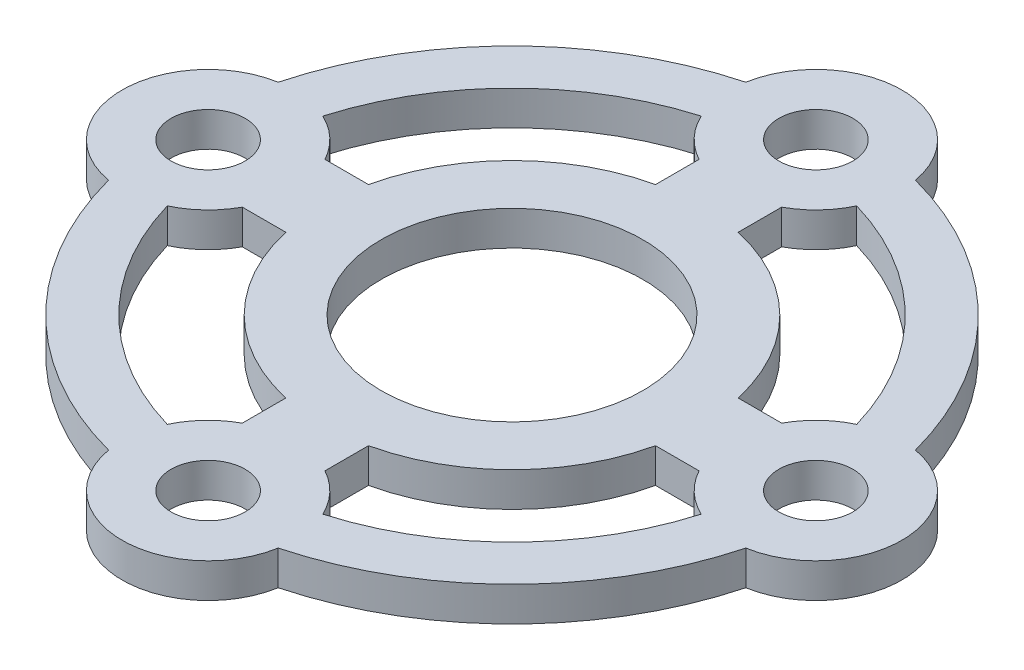
ISO-10303-21;
HEADER;
FILE_DESCRIPTION(('STEP AP214'),'2;1');
FILE_NAME('part.step','',(''),(''),'','','');
FILE_SCHEMA(('AUTOMOTIVE_DESIGN { 1 0 10303 214 1 1 1 1 }'));
ENDSEC;
DATA;
#1=APPLICATION_CONTEXT('core data for automotive mechanical design processes');
#2=APPLICATION_PROTOCOL_DEFINITION('international standard','automotive_design',2000,#1);
#3=PRODUCT_CONTEXT('',#1,'mechanical');
#4=PRODUCT('Part','Part','',(#3));
#5=PRODUCT_RELATED_PRODUCT_CATEGORY('part','',(#4));
#6=PRODUCT_DEFINITION_FORMATION('','',#4);
#7=PRODUCT_DEFINITION_CONTEXT('part definition',#1,'design');
#8=PRODUCT_DEFINITION('design','',#6,#7);
#9=PRODUCT_DEFINITION_SHAPE('','',#8);
#10=(LENGTH_UNIT() NAMED_UNIT(*) SI_UNIT(.MILLI.,.METRE.));
#11=(NAMED_UNIT(*) PLANE_ANGLE_UNIT() SI_UNIT($,.RADIAN.));
#12=(NAMED_UNIT(*) SI_UNIT($,.STERADIAN.) SOLID_ANGLE_UNIT());
#13=UNCERTAINTY_MEASURE_WITH_UNIT(LENGTH_MEASURE(1.E-05),#10,'distance_accuracy_value','');
#14=(GEOMETRIC_REPRESENTATION_CONTEXT(3) GLOBAL_UNCERTAINTY_ASSIGNED_CONTEXT((#13)) GLOBAL_UNIT_ASSIGNED_CONTEXT((#10,
#11,#12)) REPRESENTATION_CONTEXT('',''));
#15=CARTESIAN_POINT('',(0.,0.,0.));
#16=DIRECTION('',(0.,0.,1.));
#17=DIRECTION('',(1.,0.,0.));
#18=AXIS2_PLACEMENT_3D('',#15,#16,#17);
#19=CARTESIAN_POINT('',(0.,2.,2.4));
#20=DIRECTION('',(0.,0.,1.));
#21=DIRECTION('',(1.,0.,0.));
#22=AXIS2_PLACEMENT_3D('',#19,#20,#21);
#23=PLANE('',#22);
#24=DIRECTION('',(-1.,0.,0.));
#25=VECTOR('',#24,1.);
#26=CARTESIAN_POINT('',(0.,0.,2.4));
#27=LINE('',#26,#25);
#28=CARTESIAN_POINT('',(-10.7349895202557,0.,2.4));
#29=VERTEX_POINT('',#28);
#30=CARTESIAN_POINT('',(-13.2636575601077,0.,2.4));
#31=VERTEX_POINT('',#30);
#32=EDGE_CURVE('E748',#29,#31,#27,.T.);
#33=ORIENTED_EDGE('',*,*,#32,.F.);
#34=DIRECTION('',(0.,-1.,0.));
#35=VECTOR('',#34,1.);
#36=CARTESIAN_POINT('',(-10.7349895202557,2.,2.4));
#37=LINE('',#36,#35);
#38=CARTESIAN_POINT('',(-10.7349895202557,2.,2.4));
#39=VERTEX_POINT('',#38);
#40=EDGE_CURVE('E369',#39,#29,#37,.T.);
#41=ORIENTED_EDGE('',*,*,#40,.F.);
#42=DIRECTION('',(-1.,0.,0.));
#43=VECTOR('',#42,1.);
#44=CARTESIAN_POINT('',(0.,2.,2.4));
#45=LINE('',#44,#43);
#46=CARTESIAN_POINT('',(-13.2636575601077,2.,2.4));
#47=VERTEX_POINT('',#46);
#48=EDGE_CURVE('E741',#39,#47,#45,.T.);
#49=ORIENTED_EDGE('',*,*,#48,.T.);
#50=DIRECTION('',(0.,-1.,0.));
#51=VECTOR('',#50,1.);
#52=CARTESIAN_POINT('',(-13.2636575601077,2.,2.4));
#53=LINE('',#52,#51);
#54=EDGE_CURVE('E12',#47,#31,#53,.T.);
#55=ORIENTED_EDGE('',*,*,#54,.T.);
#56=EDGE_LOOP('',(#33,#41,#49,#55));
#57=FACE_BOUND('',#56,.T.);
#58=ADVANCED_FACE('F359',(#57),#23,.T.);
#59=CARTESIAN_POINT('',(0.,2.,-2.4));
#60=DIRECTION('',(0.,0.,1.));
#61=DIRECTION('',(1.,0.,0.));
#62=AXIS2_PLACEMENT_3D('',#59,#60,#61);
#63=PLANE('',#62);
#64=DIRECTION('',(-1.,0.,0.));
#65=VECTOR('',#64,1.);
#66=CARTESIAN_POINT('',(0.,0.,-2.4));
#67=LINE('',#66,#65);
#68=CARTESIAN_POINT('',(-10.7349895202557,0.,-2.4));
#69=VERTEX_POINT('',#68);
#70=CARTESIAN_POINT('',(-13.2636575601077,0.,-2.4));
#71=VERTEX_POINT('',#70);
#72=EDGE_CURVE('E745',#69,#71,#67,.T.);
#73=ORIENTED_EDGE('',*,*,#72,.T.);
#74=DIRECTION('',(0.,-1.,0.));
#75=VECTOR('',#74,1.);
#76=CARTESIAN_POINT('',(-13.2636575601077,2.,-2.4));
#77=LINE('',#76,#75);
#78=CARTESIAN_POINT('',(-13.2636575601077,2.,-2.4));
#79=VERTEX_POINT('',#78);
#80=EDGE_CURVE('E378',#79,#71,#77,.T.);
#81=ORIENTED_EDGE('',*,*,#80,.F.);
#82=DIRECTION('',(-1.,0.,0.));
#83=VECTOR('',#82,1.);
#84=CARTESIAN_POINT('',(0.,2.,-2.4));
#85=LINE('',#84,#83);
#86=CARTESIAN_POINT('',(-10.7349895202557,2.,-2.4));
#87=VERTEX_POINT('',#86);
#88=EDGE_CURVE('E744',#87,#79,#85,.T.);
#89=ORIENTED_EDGE('',*,*,#88,.F.);
#90=DIRECTION('',(0.,-1.,0.));
#91=VECTOR('',#90,1.);
#92=CARTESIAN_POINT('',(-10.7349895202557,2.,-2.4));
#93=LINE('',#92,#91);
#94=EDGE_CURVE('E754',#87,#69,#93,.T.);
#95=ORIENTED_EDGE('',*,*,#94,.T.);
#96=EDGE_LOOP('',(#73,#81,#89,#95));
#97=FACE_BOUND('',#96,.T.);
#98=ADVANCED_FACE('F866',(#97),#63,.F.);
#99=CARTESIAN_POINT('',(0.,0.,0.));
#100=DIRECTION('',(0.,1.,0.));
#101=DIRECTION('',(0.,0.,1.));
#102=AXIS2_PLACEMENT_3D('',#99,#100,#101);
#103=PLANE('',#102);
#104=CARTESIAN_POINT('',(17.65,0.,1.21087789660668E-13));
#105=DIRECTION('',(0.,-1.,0.));
#106=DIRECTION('',(0.,0.,-1.));
#107=AXIS2_PLACEMENT_3D('',#104,#105,#106);
#108=CIRCLE('',#107,2.15);
#109=CARTESIAN_POINT('',(17.65,0.,-2.14999999999988));
#110=VERTEX_POINT('',#109);
#111=EDGE_CURVE('E999',#110,#110,#108,.T.);
#112=ORIENTED_EDGE('',*,*,#111,.F.);
#113=EDGE_LOOP('',(#112));
#114=FACE_BOUND('',#113,.T.);
#115=CARTESIAN_POINT('',(0.,0.,-17.65));
#116=DIRECTION('',(0.,-1.,0.));
#117=DIRECTION('',(0.,0.,-1.));
#118=AXIS2_PLACEMENT_3D('',#115,#116,#117);
#119=CIRCLE('',#118,2.15);
#120=CARTESIAN_POINT('',(0.,0.,-19.8));
#121=VERTEX_POINT('',#120);
#122=EDGE_CURVE('E1001',#121,#121,#119,.T.);
#123=ORIENTED_EDGE('',*,*,#122,.F.);
#124=EDGE_LOOP('',(#123));
#125=FACE_BOUND('',#124,.T.);
#126=CARTESIAN_POINT('',(-17.65,0.,0.));
#127=DIRECTION('',(0.,-1.,0.));
#128=DIRECTION('',(0.,0.,-1.));
#129=AXIS2_PLACEMENT_3D('',#126,#127,#128);
#130=CIRCLE('',#129,2.15);
#131=CARTESIAN_POINT('',(-17.65,0.,-2.15));
#132=VERTEX_POINT('',#131);
#133=EDGE_CURVE('E1009',#132,#132,#130,.T.);
#134=ORIENTED_EDGE('',*,*,#133,.F.);
#135=EDGE_LOOP('',(#134));
#136=FACE_BOUND('',#135,.T.);
#137=CARTESIAN_POINT('',(-1.86181882243202E-13,0.,17.65));
#138=DIRECTION('',(0.,-1.,0.));
#139=DIRECTION('',(0.,0.,-1.));
#140=AXIS2_PLACEMENT_3D('',#137,#138,#139);
#141=CIRCLE('',#140,2.15);
#142=CARTESIAN_POINT('',(-1.86181882243202E-13,0.,15.5));
#143=VERTEX_POINT('',#142);
#144=EDGE_CURVE('E732',#143,#143,#141,.T.);
#145=ORIENTED_EDGE('',*,*,#144,.F.);
#146=EDGE_LOOP('',(#145));
#147=FACE_BOUND('',#146,.T.);
#148=CARTESIAN_POINT('',(-1.86181882243202E-13,0.,17.65));
#149=DIRECTION('',(0.,1.,0.));
#150=DIRECTION('',(0.,0.,1.));
#151=AXIS2_PLACEMENT_3D('',#148,#149,#150);
#152=CIRCLE('',#151,5.);
#153=CARTESIAN_POINT('',(-4.92626415752397,0.,18.5055240793201));
#154=VERTEX_POINT('',#153);
#155=CARTESIAN_POINT('',(4.92626415752358,0.,18.5055240793202));
#156=VERTEX_POINT('',#155);
#157=EDGE_CURVE('E603',#154,#156,#152,.T.);
#158=ORIENTED_EDGE('',*,*,#157,.F.);
#159=CARTESIAN_POINT('',(0.,0.,0.));
#160=DIRECTION('',(0.,1.,0.));
#161=DIRECTION('',(0.,0.,1.));
#162=AXIS2_PLACEMENT_3D('',#159,#160,#161);
#163=CIRCLE('',#162,19.15);
#164=CARTESIAN_POINT('',(-18.5055240793201,0.,4.92626415752378));
#165=VERTEX_POINT('',#164);
#166=EDGE_CURVE('E588',#165,#154,#163,.T.);
#167=ORIENTED_EDGE('',*,*,#166,.F.);
#168=CARTESIAN_POINT('',(-17.65,0.,0.));
#169=DIRECTION('',(0.,1.,0.));
#170=DIRECTION('',(0.,0.,1.));
#171=AXIS2_PLACEMENT_3D('',#168,#169,#170);
#172=CIRCLE('',#171,5.);
#173=CARTESIAN_POINT('',(-18.5055240793201,0.,-4.92626415752378));
#174=VERTEX_POINT('',#173);
#175=EDGE_CURVE('E641',#174,#165,#172,.T.);
#176=ORIENTED_EDGE('',*,*,#175,.F.);
#177=CARTESIAN_POINT('',(-4.92626415752371,0.,-18.5055240793201));
#178=VERTEX_POINT('',#177);
#179=EDGE_CURVE('E944',#178,#174,#163,.T.);
#180=ORIENTED_EDGE('',*,*,#179,.F.);
#181=CARTESIAN_POINT('',(0.,0.,-17.65));
#182=DIRECTION('',(0.,1.,0.));
#183=DIRECTION('',(0.,0.,1.));
#184=AXIS2_PLACEMENT_3D('',#181,#182,#183);
#185=CIRCLE('',#184,5.);
#186=CARTESIAN_POINT('',(4.92626415752385,0.,-18.5055240793201));
#187=VERTEX_POINT('',#186);
#188=EDGE_CURVE('E685',#187,#178,#185,.T.);
#189=ORIENTED_EDGE('',*,*,#188,.F.);
#190=CARTESIAN_POINT('',(18.5055240793201,0.,-4.92626415752365));
#191=VERTEX_POINT('',#190);
#192=EDGE_CURVE('E938',#191,#187,#163,.T.);
#193=ORIENTED_EDGE('',*,*,#192,.F.);
#194=CARTESIAN_POINT('',(17.65,0.,1.21087789660668E-13));
#195=DIRECTION('',(0.,1.,0.));
#196=DIRECTION('',(0.,0.,1.));
#197=AXIS2_PLACEMENT_3D('',#194,#195,#196);
#198=CIRCLE('',#197,5.);
#199=CARTESIAN_POINT('',(18.5055240793201,0.,4.92626415752391));
#200=VERTEX_POINT('',#199);
#201=EDGE_CURVE('E691',#200,#191,#198,.T.);
#202=ORIENTED_EDGE('',*,*,#201,.F.);
#203=EDGE_CURVE('E582',#156,#200,#163,.T.);
#204=ORIENTED_EDGE('',*,*,#203,.F.);
#205=EDGE_LOOP('',(#158,#167,#176,#180,#189,#193,#202,#204));
#206=FACE_BOUND('',#205,.T.);
#207=CARTESIAN_POINT('',(4.5167713054374,0.,15.5055240793202));
#208=VERTEX_POINT('',#207);
#209=CARTESIAN_POINT('',(2.4,0.,13.2636575601078));
#210=VERTEX_POINT('',#209);
#211=EDGE_CURVE('E597',#208,#210,#152,.T.);
#212=ORIENTED_EDGE('',*,*,#211,.F.);
#213=CARTESIAN_POINT('',(0.,0.,0.));
#214=DIRECTION('',(0.,1.,0.));
#215=DIRECTION('',(0.,0.,1.));
#216=AXIS2_PLACEMENT_3D('',#213,#214,#215);
#217=CIRCLE('',#216,16.15);
#218=CARTESIAN_POINT('',(15.5055240793201,0.,4.51677130543767));
#219=VERTEX_POINT('',#218);
#220=EDGE_CURVE('E711',#208,#219,#217,.T.);
#221=ORIENTED_EDGE('',*,*,#220,.T.);
#222=CARTESIAN_POINT('',(13.2636575601077,0.,2.4));
#223=VERTEX_POINT('',#222);
#224=EDGE_CURVE('E619',#223,#219,#198,.T.);
#225=ORIENTED_EDGE('',*,*,#224,.F.);
#226=DIRECTION('',(-1.,0.,0.));
#227=VECTOR('',#226,1.);
#228=CARTESIAN_POINT('',(0.,0.,2.4));
#229=LINE('',#228,#227);
#230=CARTESIAN_POINT('',(10.7349895202557,0.,2.4));
#231=VERTEX_POINT('',#230);
#232=EDGE_CURVE('E781',#223,#231,#229,.T.);
#233=ORIENTED_EDGE('',*,*,#232,.T.);
#234=CARTESIAN_POINT('',(0.,0.,0.));
#235=DIRECTION('',(0.,1.,0.));
#236=DIRECTION('',(0.,0.,1.));
#237=AXIS2_PLACEMENT_3D('',#234,#235,#236);
#238=CIRCLE('',#237,11.);
#239=CARTESIAN_POINT('',(2.4,0.,10.7349895202557));
#240=VERTEX_POINT('',#239);
#241=EDGE_CURVE('E672',#240,#231,#238,.T.);
#242=ORIENTED_EDGE('',*,*,#241,.F.);
#243=DIRECTION('',(0.,0.,-1.));
#244=VECTOR('',#243,1.);
#245=CARTESIAN_POINT('',(2.4,0.,0.));
#246=LINE('',#245,#244);
#247=EDGE_CURVE('E669',#210,#240,#246,.T.);
#248=ORIENTED_EDGE('',*,*,#247,.F.);
#249=EDGE_LOOP('',(#212,#221,#225,#233,#242,#248));
#250=FACE_BOUND('',#249,.T.);
#251=CARTESIAN_POINT('',(15.5055240793201,0.,-4.51677130543746));
#252=VERTEX_POINT('',#251);
#253=CARTESIAN_POINT('',(13.2636575601078,0.,-2.4));
#254=VERTEX_POINT('',#253);
#255=EDGE_CURVE('E693',#252,#254,#198,.T.);
#256=ORIENTED_EDGE('',*,*,#255,.F.);
#257=CARTESIAN_POINT('',(4.51677130543762,0.,-15.5055240793201));
#258=VERTEX_POINT('',#257);
#259=EDGE_CURVE('E718',#252,#258,#217,.T.);
#260=ORIENTED_EDGE('',*,*,#259,.T.);
#261=CARTESIAN_POINT('',(2.4,0.,-13.2636575601077));
#262=VERTEX_POINT('',#261);
#263=EDGE_CURVE('E630',#262,#258,#185,.T.);
#264=ORIENTED_EDGE('',*,*,#263,.F.);
#265=DIRECTION('',(0.,0.,-1.));
#266=VECTOR('',#265,1.);
#267=CARTESIAN_POINT('',(2.4,0.,0.));
#268=LINE('',#267,#266);
#269=CARTESIAN_POINT('',(2.4,0.,-10.7349895202557));
#270=VERTEX_POINT('',#269);
#271=EDGE_CURVE('E761',#270,#262,#268,.T.);
#272=ORIENTED_EDGE('',*,*,#271,.F.);
#273=CARTESIAN_POINT('',(10.7349895202557,0.,-2.4));
#274=VERTEX_POINT('',#273);
#275=EDGE_CURVE('E675',#274,#270,#238,.T.);
#276=ORIENTED_EDGE('',*,*,#275,.F.);
#277=DIRECTION('',(-1.,0.,0.));
#278=VECTOR('',#277,1.);
#279=CARTESIAN_POINT('',(0.,0.,-2.4));
#280=LINE('',#279,#278);
#281=EDGE_CURVE('E784',#254,#274,#280,.T.);
#282=ORIENTED_EDGE('',*,*,#281,.F.);
#283=EDGE_LOOP('',(#256,#260,#264,#272,#276,#282));
#284=FACE_BOUND('',#283,.T.);
#285=CARTESIAN_POINT('',(-4.5167713054375,0.,-15.5055240793201));
#286=VERTEX_POINT('',#285);
#287=CARTESIAN_POINT('',(-2.4,0.,-13.2636575601078));
#288=VERTEX_POINT('',#287);
#289=EDGE_CURVE('E687',#286,#288,#185,.T.);
#290=ORIENTED_EDGE('',*,*,#289,.F.);
#291=CARTESIAN_POINT('',(-15.5055240793201,0.,-4.51677130543756));
#292=VERTEX_POINT('',#291);
#293=EDGE_CURVE('E724',#286,#292,#217,.T.);
#294=ORIENTED_EDGE('',*,*,#293,.T.);
#295=EDGE_CURVE('E681',#71,#292,#172,.T.);
#296=ORIENTED_EDGE('',*,*,#295,.F.);
#297=ORIENTED_EDGE('',*,*,#72,.F.);
#298=CARTESIAN_POINT('',(-2.4,0.,-10.7349895202557));
#299=VERTEX_POINT('',#298);
#300=EDGE_CURVE('E966',#299,#69,#238,.T.);
#301=ORIENTED_EDGE('',*,*,#300,.F.);
#302=DIRECTION('',(0.,0.,-1.));
#303=VECTOR('',#302,1.);
#304=CARTESIAN_POINT('',(-2.4,0.,0.));
#305=LINE('',#304,#303);
#306=EDGE_CURVE('E765',#299,#288,#305,.T.);
#307=ORIENTED_EDGE('',*,*,#306,.T.);
#308=EDGE_LOOP('',(#290,#294,#296,#297,#301,#307));
#309=FACE_BOUND('',#308,.T.);
#310=ORIENTED_EDGE('',*,*,#32,.T.);
#311=CARTESIAN_POINT('',(-15.5055240793201,0.,4.51677130543756));
#312=VERTEX_POINT('',#311);
#313=EDGE_CURVE('E679',#312,#31,#172,.T.);
#314=ORIENTED_EDGE('',*,*,#313,.F.);
#315=CARTESIAN_POINT('',(-4.51677130543773,0.,15.5055240793201));
#316=VERTEX_POINT('',#315);
#317=EDGE_CURVE('E720',#312,#316,#217,.T.);
#318=ORIENTED_EDGE('',*,*,#317,.T.);
#319=CARTESIAN_POINT('',(-2.4,0.,13.2636575601076));
#320=VERTEX_POINT('',#319);
#321=EDGE_CURVE('E601',#320,#316,#152,.T.);
#322=ORIENTED_EDGE('',*,*,#321,.F.);
#323=DIRECTION('',(0.,0.,-1.));
#324=VECTOR('',#323,1.);
#325=CARTESIAN_POINT('',(-2.4,0.,0.));
#326=LINE('',#325,#324);
#327=CARTESIAN_POINT('',(-2.4,0.,10.7349895202557));
#328=VERTEX_POINT('',#327);
#329=EDGE_CURVE('E798',#320,#328,#326,.T.);
#330=ORIENTED_EDGE('',*,*,#329,.T.);
#331=EDGE_CURVE('E662',#29,#328,#238,.T.);
#332=ORIENTED_EDGE('',*,*,#331,.F.);
#333=EDGE_LOOP('',(#310,#314,#318,#322,#330,#332));
#334=FACE_BOUND('',#333,.T.);
#335=CARTESIAN_POINT('',(0.,0.,0.));
#336=DIRECTION('',(0.,1.,0.));
#337=DIRECTION('',(0.,0.,1.));
#338=AXIS2_PLACEMENT_3D('',#335,#336,#337);
#339=CIRCLE('',#338,7.6);
#340=CARTESIAN_POINT('',(0.,0.,7.6));
#341=VERTEX_POINT('',#340);
#342=EDGE_CURVE('E651',#341,#341,#339,.T.);
#343=ORIENTED_EDGE('',*,*,#342,.T.);
#344=EDGE_LOOP('',(#343));
#345=FACE_BOUND('',#344,.T.);
#346=ADVANCED_FACE('F714',(#114,#125,#136,#147,#206,#250,#284,#309,#334,#345),#103,.F.);
#347=CARTESIAN_POINT('',(0.,2.,0.));
#348=DIRECTION('',(0.,1.,0.));
#349=DIRECTION('',(0.,0.,1.));
#350=AXIS2_PLACEMENT_3D('',#347,#348,#349);
#351=PLANE('',#350);
#352=CARTESIAN_POINT('',(17.65,2.,1.21087789660668E-13));
#353=DIRECTION('',(0.,1.,0.));
#354=DIRECTION('',(0.,0.,1.));
#355=AXIS2_PLACEMENT_3D('',#352,#353,#354);
#356=CIRCLE('',#355,2.15);
#357=CARTESIAN_POINT('',(17.65,2.,2.15000000000012));
#358=VERTEX_POINT('',#357);
#359=EDGE_CURVE('E997',#358,#358,#356,.T.);
#360=ORIENTED_EDGE('',*,*,#359,.F.);
#361=EDGE_LOOP('',(#360));
#362=FACE_BOUND('',#361,.T.);
#363=CARTESIAN_POINT('',(0.,2.,-17.65));
#364=DIRECTION('',(0.,1.,0.));
#365=DIRECTION('',(0.,0.,1.));
#366=AXIS2_PLACEMENT_3D('',#363,#364,#365);
#367=CIRCLE('',#366,2.15);
#368=CARTESIAN_POINT('',(0.,2.,-15.5));
#369=VERTEX_POINT('',#368);
#370=EDGE_CURVE('E1006',#369,#369,#367,.T.);
#371=ORIENTED_EDGE('',*,*,#370,.F.);
#372=EDGE_LOOP('',(#371));
#373=FACE_BOUND('',#372,.T.);
#374=CARTESIAN_POINT('',(-17.65,2.,0.));
#375=DIRECTION('',(0.,1.,0.));
#376=DIRECTION('',(0.,0.,1.));
#377=AXIS2_PLACEMENT_3D('',#374,#375,#376);
#378=CIRCLE('',#377,2.15);
#379=CARTESIAN_POINT('',(-17.65,2.,2.15));
#380=VERTEX_POINT('',#379);
#381=EDGE_CURVE('E737',#380,#380,#378,.T.);
#382=ORIENTED_EDGE('',*,*,#381,.F.);
#383=EDGE_LOOP('',(#382));
#384=FACE_BOUND('',#383,.T.);
#385=CARTESIAN_POINT('',(-1.86181882243202E-13,2.,17.65));
#386=DIRECTION('',(0.,1.,0.));
#387=DIRECTION('',(0.,0.,1.));
#388=AXIS2_PLACEMENT_3D('',#385,#386,#387);
#389=CIRCLE('',#388,2.15);
#390=CARTESIAN_POINT('',(-1.86181882243202E-13,2.,19.8));
#391=VERTEX_POINT('',#390);
#392=EDGE_CURVE('E726',#391,#391,#389,.T.);
#393=ORIENTED_EDGE('',*,*,#392,.F.);
#394=EDGE_LOOP('',(#393));
#395=FACE_BOUND('',#394,.T.);
#396=CARTESIAN_POINT('',(0.,2.,0.));
#397=DIRECTION('',(0.,1.,0.));
#398=DIRECTION('',(0.,0.,1.));
#399=AXIS2_PLACEMENT_3D('',#396,#397,#398);
#400=CIRCLE('',#399,19.15);
#401=CARTESIAN_POINT('',(-18.5055240793201,2.,4.92626415752378));
#402=VERTEX_POINT('',#401);
#403=CARTESIAN_POINT('',(-4.92626415752397,2.,18.5055240793201));
#404=VERTEX_POINT('',#403);
#405=EDGE_CURVE('E570',#402,#404,#400,.T.);
#406=ORIENTED_EDGE('',*,*,#405,.T.);
#407=CARTESIAN_POINT('',(-1.86181882243202E-13,2.,17.65));
#408=DIRECTION('',(0.,1.,0.));
#409=DIRECTION('',(0.,0.,1.));
#410=AXIS2_PLACEMENT_3D('',#407,#408,#409);
#411=CIRCLE('',#410,5.);
#412=CARTESIAN_POINT('',(4.92626415752358,2.,18.5055240793202));
#413=VERTEX_POINT('',#412);
#414=EDGE_CURVE('E576',#404,#413,#411,.T.);
#415=ORIENTED_EDGE('',*,*,#414,.T.);
#416=CARTESIAN_POINT('',(18.5055240793201,2.,4.92626415752391));
#417=VERTEX_POINT('',#416);
#418=EDGE_CURVE('E584',#413,#417,#400,.T.);
#419=ORIENTED_EDGE('',*,*,#418,.T.);
#420=CARTESIAN_POINT('',(17.65,2.,1.21087789660668E-13));
#421=DIRECTION('',(0.,1.,0.));
#422=DIRECTION('',(0.,0.,1.));
#423=AXIS2_PLACEMENT_3D('',#420,#421,#422);
#424=CIRCLE('',#423,5.);
#425=CARTESIAN_POINT('',(18.5055240793201,2.,-4.92626415752365));
#426=VERTEX_POINT('',#425);
#427=EDGE_CURVE('E623',#417,#426,#424,.T.);
#428=ORIENTED_EDGE('',*,*,#427,.T.);
#429=CARTESIAN_POINT('',(4.92626415752385,2.,-18.5055240793201));
#430=VERTEX_POINT('',#429);
#431=EDGE_CURVE('E948',#426,#430,#400,.T.);
#432=ORIENTED_EDGE('',*,*,#431,.T.);
#433=CARTESIAN_POINT('',(0.,2.,-17.65));
#434=DIRECTION('',(0.,1.,0.));
#435=DIRECTION('',(0.,0.,1.));
#436=AXIS2_PLACEMENT_3D('',#433,#434,#435);
#437=CIRCLE('',#436,5.);
#438=CARTESIAN_POINT('',(-4.92626415752371,2.,-18.5055240793201));
#439=VERTEX_POINT('',#438);
#440=EDGE_CURVE('E634',#430,#439,#437,.T.);
#441=ORIENTED_EDGE('',*,*,#440,.T.);
#442=CARTESIAN_POINT('',(-18.5055240793201,2.,-4.92626415752378));
#443=VERTEX_POINT('',#442);
#444=EDGE_CURVE('E581',#439,#443,#400,.T.);
#445=ORIENTED_EDGE('',*,*,#444,.T.);
#446=CARTESIAN_POINT('',(-17.65,2.,0.));
#447=DIRECTION('',(0.,1.,0.));
#448=DIRECTION('',(0.,0.,1.));
#449=AXIS2_PLACEMENT_3D('',#446,#447,#448);
#450=CIRCLE('',#449,5.);
#451=EDGE_CURVE('E579',#443,#402,#450,.T.);
#452=ORIENTED_EDGE('',*,*,#451,.T.);
#453=EDGE_LOOP('',(#406,#415,#419,#428,#432,#441,#445,#452));
#454=FACE_BOUND('',#453,.T.);
#455=CARTESIAN_POINT('',(0.,2.,0.));
#456=DIRECTION('',(0.,1.,0.));
#457=DIRECTION('',(0.,0.,1.));
#458=AXIS2_PLACEMENT_3D('',#455,#456,#457);
#459=CIRCLE('',#458,16.15);
#460=CARTESIAN_POINT('',(4.5167713054374,2.,15.5055240793202));
#461=VERTEX_POINT('',#460);
#462=CARTESIAN_POINT('',(15.5055240793201,2.,4.51677130543767));
#463=VERTEX_POINT('',#462);
#464=EDGE_CURVE('E713',#461,#463,#459,.T.);
#465=ORIENTED_EDGE('',*,*,#464,.F.);
#466=CARTESIAN_POINT('',(2.4,2.,13.2636575601078));
#467=VERTEX_POINT('',#466);
#468=EDGE_CURVE('E599',#461,#467,#411,.T.);
#469=ORIENTED_EDGE('',*,*,#468,.T.);
#470=DIRECTION('',(0.,0.,-1.));
#471=VECTOR('',#470,1.);
#472=CARTESIAN_POINT('',(2.4,2.,0.));
#473=LINE('',#472,#471);
#474=CARTESIAN_POINT('',(2.4,2.,10.7349895202557));
#475=VERTEX_POINT('',#474);
#476=EDGE_CURVE('E795',#467,#475,#473,.T.);
#477=ORIENTED_EDGE('',*,*,#476,.T.);
#478=CARTESIAN_POINT('',(0.,2.,0.));
#479=DIRECTION('',(0.,1.,0.));
#480=DIRECTION('',(0.,0.,1.));
#481=AXIS2_PLACEMENT_3D('',#478,#479,#480);
#482=CIRCLE('',#481,11.);
#483=CARTESIAN_POINT('',(10.7349895202557,2.,2.4));
#484=VERTEX_POINT('',#483);
#485=EDGE_CURVE('E666',#475,#484,#482,.T.);
#486=ORIENTED_EDGE('',*,*,#485,.T.);
#487=DIRECTION('',(-1.,0.,0.));
#488=VECTOR('',#487,1.);
#489=CARTESIAN_POINT('',(0.,2.,2.4));
#490=LINE('',#489,#488);
#491=CARTESIAN_POINT('',(13.2636575601077,2.,2.4));
#492=VERTEX_POINT('',#491);
#493=EDGE_CURVE('E780',#492,#484,#490,.T.);
#494=ORIENTED_EDGE('',*,*,#493,.F.);
#495=EDGE_CURVE('E690',#492,#463,#424,.T.);
#496=ORIENTED_EDGE('',*,*,#495,.T.);
#497=EDGE_LOOP('',(#465,#469,#477,#486,#494,#496));
#498=FACE_BOUND('',#497,.T.);
#499=CARTESIAN_POINT('',(15.5055240793201,2.,-4.51677130543746));
#500=VERTEX_POINT('',#499);
#501=CARTESIAN_POINT('',(4.51677130543762,2.,-15.5055240793201));
#502=VERTEX_POINT('',#501);
#503=EDGE_CURVE('E830',#500,#502,#459,.T.);
#504=ORIENTED_EDGE('',*,*,#503,.F.);
#505=CARTESIAN_POINT('',(13.2636575601078,2.,-2.4));
#506=VERTEX_POINT('',#505);
#507=EDGE_CURVE('E689',#500,#506,#424,.T.);
#508=ORIENTED_EDGE('',*,*,#507,.T.);
#509=DIRECTION('',(-1.,0.,0.));
#510=VECTOR('',#509,1.);
#511=CARTESIAN_POINT('',(0.,2.,-2.4));
#512=LINE('',#511,#510);
#513=CARTESIAN_POINT('',(10.7349895202557,2.,-2.4));
#514=VERTEX_POINT('',#513);
#515=EDGE_CURVE('E777',#506,#514,#512,.T.);
#516=ORIENTED_EDGE('',*,*,#515,.T.);
#517=CARTESIAN_POINT('',(2.4,2.,-10.7349895202557));
#518=VERTEX_POINT('',#517);
#519=EDGE_CURVE('E670',#514,#518,#482,.T.);
#520=ORIENTED_EDGE('',*,*,#519,.T.);
#521=DIRECTION('',(0.,0.,-1.));
#522=VECTOR('',#521,1.);
#523=CARTESIAN_POINT('',(2.4,2.,0.));
#524=LINE('',#523,#522);
#525=CARTESIAN_POINT('',(2.4,2.,-13.2636575601077));
#526=VERTEX_POINT('',#525);
#527=EDGE_CURVE('E760',#518,#526,#524,.T.);
#528=ORIENTED_EDGE('',*,*,#527,.T.);
#529=EDGE_CURVE('E682',#526,#502,#437,.T.);
#530=ORIENTED_EDGE('',*,*,#529,.T.);
#531=EDGE_LOOP('',(#504,#508,#516,#520,#528,#530));
#532=FACE_BOUND('',#531,.T.);
#533=CARTESIAN_POINT('',(-4.5167713054375,2.,-15.5055240793201));
#534=VERTEX_POINT('',#533);
#535=CARTESIAN_POINT('',(-15.5055240793201,2.,-4.51677130543756));
#536=VERTEX_POINT('',#535);
#537=EDGE_CURVE('E721',#534,#536,#459,.T.);
#538=ORIENTED_EDGE('',*,*,#537,.F.);
#539=CARTESIAN_POINT('',(-2.4,2.,-13.2636575601078));
#540=VERTEX_POINT('',#539);
#541=EDGE_CURVE('E684',#534,#540,#437,.T.);
#542=ORIENTED_EDGE('',*,*,#541,.T.);
#543=DIRECTION('',(0.,0.,-1.));
#544=VECTOR('',#543,1.);
#545=CARTESIAN_POINT('',(-2.4,2.,0.));
#546=LINE('',#545,#544);
#547=CARTESIAN_POINT('',(-2.4,2.,-10.7349895202557));
#548=VERTEX_POINT('',#547);
#549=EDGE_CURVE('E757',#548,#540,#546,.T.);
#550=ORIENTED_EDGE('',*,*,#549,.F.);
#551=EDGE_CURVE('E1232',#548,#87,#482,.T.);
#552=ORIENTED_EDGE('',*,*,#551,.T.);
#553=ORIENTED_EDGE('',*,*,#88,.T.);
#554=EDGE_CURVE('E678',#79,#536,#450,.T.);
#555=ORIENTED_EDGE('',*,*,#554,.T.);
#556=EDGE_LOOP('',(#538,#542,#550,#552,#553,#555));
#557=FACE_BOUND('',#556,.T.);
#558=CARTESIAN_POINT('',(-2.4,2.,13.2636575601076));
#559=VERTEX_POINT('',#558);
#560=CARTESIAN_POINT('',(-4.51677130543773,2.,15.5055240793201));
#561=VERTEX_POINT('',#560);
#562=EDGE_CURVE('E563',#559,#561,#411,.T.);
#563=ORIENTED_EDGE('',*,*,#562,.T.);
#564=CARTESIAN_POINT('',(-15.5055240793201,2.,4.51677130543756));
#565=VERTEX_POINT('',#564);
#566=EDGE_CURVE('E717',#565,#561,#459,.T.);
#567=ORIENTED_EDGE('',*,*,#566,.F.);
#568=EDGE_CURVE('E645',#565,#47,#450,.T.);
#569=ORIENTED_EDGE('',*,*,#568,.T.);
#570=ORIENTED_EDGE('',*,*,#48,.F.);
#571=CARTESIAN_POINT('',(-2.4,2.,10.7349895202557));
#572=VERTEX_POINT('',#571);
#573=EDGE_CURVE('E671',#39,#572,#482,.T.);
#574=ORIENTED_EDGE('',*,*,#573,.T.);
#575=DIRECTION('',(0.,0.,-1.));
#576=VECTOR('',#575,1.);
#577=CARTESIAN_POINT('',(-2.4,2.,0.));
#578=LINE('',#577,#576);
#579=EDGE_CURVE('E797',#559,#572,#578,.T.);
#580=ORIENTED_EDGE('',*,*,#579,.F.);
#581=EDGE_LOOP('',(#563,#567,#569,#570,#574,#580));
#582=FACE_BOUND('',#581,.T.);
#583=CARTESIAN_POINT('',(0.,2.,0.));
#584=DIRECTION('',(0.,1.,0.));
#585=DIRECTION('',(0.,0.,1.));
#586=AXIS2_PLACEMENT_3D('',#583,#584,#585);
#587=CIRCLE('',#586,7.6);
#588=CARTESIAN_POINT('',(0.,2.,7.6));
#589=VERTEX_POINT('',#588);
#590=EDGE_CURVE('E657',#589,#589,#587,.T.);
#591=ORIENTED_EDGE('',*,*,#590,.F.);
#592=EDGE_LOOP('',(#591));
#593=FACE_BOUND('',#592,.T.);
#594=ADVANCED_FACE('F572',(#362,#373,#384,#395,#454,#498,#532,#557,#582,#593),#351,.T.);
#595=CARTESIAN_POINT('',(17.65,2.,1.21087789660668E-13));
#596=DIRECTION('',(0.,-1.,0.));
#597=DIRECTION('',(0.,0.,-1.));
#598=AXIS2_PLACEMENT_3D('',#595,#596,#597);
#599=CYLINDRICAL_SURFACE('',#598,5.);
#600=DIRECTION('',(0.,-1.,0.));
#601=VECTOR('',#600,1.);
#602=CARTESIAN_POINT('',(18.5055240793201,1.,-4.92626415752365));
#603=LINE('',#602,#601);
#604=EDGE_CURVE('E622',#426,#191,#603,.T.);
#605=ORIENTED_EDGE('',*,*,#604,.F.);
#606=ORIENTED_EDGE('',*,*,#427,.F.);
#607=DIRECTION('',(0.,-1.,0.));
#608=VECTOR('',#607,1.);
#609=CARTESIAN_POINT('',(18.5055240793201,1.,4.92626415752391));
#610=LINE('',#609,#608);
#611=EDGE_CURVE('E620',#200,#417,#610,.F.);
#612=ORIENTED_EDGE('',*,*,#611,.F.);
#613=ORIENTED_EDGE('',*,*,#201,.T.);
#614=EDGE_LOOP('',(#605,#606,#612,#613));
#615=FACE_BOUND('',#614,.T.);
#616=ADVANCED_FACE('F822',(#615),#599,.T.);
#617=CARTESIAN_POINT('',(0.,2.,0.));
#618=DIRECTION('',(0.,-1.,0.));
#619=DIRECTION('',(0.,0.,-1.));
#620=AXIS2_PLACEMENT_3D('',#617,#618,#619);
#621=CYLINDRICAL_SURFACE('',#620,19.15);
#622=ORIENTED_EDGE('',*,*,#192,.T.);
#623=DIRECTION('',(0.,-1.,0.));
#624=VECTOR('',#623,1.);
#625=CARTESIAN_POINT('',(4.92626415752385,1.,-18.5055240793201));
#626=LINE('',#625,#624);
#627=EDGE_CURVE('E631',#187,#430,#626,.F.);
#628=ORIENTED_EDGE('',*,*,#627,.T.);
#629=ORIENTED_EDGE('',*,*,#431,.F.);
#630=ORIENTED_EDGE('',*,*,#604,.T.);
#631=EDGE_LOOP('',(#622,#628,#629,#630));
#632=FACE_BOUND('',#631,.T.);
#633=ADVANCED_FACE('F910',(#632),#621,.T.);
#634=ORIENTED_EDGE('',*,*,#203,.T.);
#635=ORIENTED_EDGE('',*,*,#611,.T.);
#636=ORIENTED_EDGE('',*,*,#418,.F.);
#637=DIRECTION('',(0.,-1.,0.));
#638=VECTOR('',#637,1.);
#639=CARTESIAN_POINT('',(4.92626415752358,1.,18.5055240793202));
#640=LINE('',#639,#638);
#641=EDGE_CURVE('E592',#413,#156,#640,.T.);
#642=ORIENTED_EDGE('',*,*,#641,.T.);
#643=EDGE_LOOP('',(#634,#635,#636,#642));
#644=FACE_BOUND('',#643,.T.);
#645=ADVANCED_FACE('F917',(#644),#621,.T.);
#646=CARTESIAN_POINT('',(-1.86181882243202E-13,2.,17.65));
#647=DIRECTION('',(0.,-1.,0.));
#648=DIRECTION('',(0.,0.,-1.));
#649=AXIS2_PLACEMENT_3D('',#646,#647,#648);
#650=CYLINDRICAL_SURFACE('',#649,5.);
#651=ORIENTED_EDGE('',*,*,#641,.F.);
#652=ORIENTED_EDGE('',*,*,#414,.F.);
#653=DIRECTION('',(0.,-1.,0.));
#654=VECTOR('',#653,1.);
#655=CARTESIAN_POINT('',(-4.92626415752398,1.,18.5055240793201));
#656=LINE('',#655,#654);
#657=EDGE_CURVE('E586',#154,#404,#656,.F.);
#658=ORIENTED_EDGE('',*,*,#657,.F.);
#659=ORIENTED_EDGE('',*,*,#157,.T.);
#660=EDGE_LOOP('',(#651,#652,#658,#659));
#661=FACE_BOUND('',#660,.T.);
#662=ADVANCED_FACE('F595',(#661),#650,.T.);
#663=CARTESIAN_POINT('',(0.,2.,-17.65));
#664=DIRECTION('',(0.,-1.,0.));
#665=DIRECTION('',(0.,0.,-1.));
#666=AXIS2_PLACEMENT_3D('',#663,#664,#665);
#667=CYLINDRICAL_SURFACE('',#666,5.);
#668=DIRECTION('',(0.,-1.,0.));
#669=VECTOR('',#668,1.);
#670=CARTESIAN_POINT('',(-4.92626415752371,1.,-18.5055240793201));
#671=LINE('',#670,#669);
#672=EDGE_CURVE('E633',#439,#178,#671,.T.);
#673=ORIENTED_EDGE('',*,*,#672,.F.);
#674=ORIENTED_EDGE('',*,*,#440,.F.);
#675=ORIENTED_EDGE('',*,*,#627,.F.);
#676=ORIENTED_EDGE('',*,*,#188,.T.);
#677=EDGE_LOOP('',(#673,#674,#675,#676));
#678=FACE_BOUND('',#677,.T.);
#679=ADVANCED_FACE('F903',(#678),#667,.T.);
#680=CARTESIAN_POINT('',(0.,2.,0.));
#681=DIRECTION('',(0.,-1.,0.));
#682=DIRECTION('',(0.,0.,-1.));
#683=AXIS2_PLACEMENT_3D('',#680,#681,#682);
#684=CYLINDRICAL_SURFACE('',#683,16.15);
#685=DIRECTION('',(0.,-1.,0.));
#686=VECTOR('',#685,1.);
#687=CARTESIAN_POINT('',(4.51677130543762,0.999999999999999,-15.5055240793201));
#688=LINE('',#687,#686);
#689=EDGE_CURVE('E636',#258,#502,#688,.F.);
#690=ORIENTED_EDGE('',*,*,#689,.F.);
#691=ORIENTED_EDGE('',*,*,#259,.F.);
#692=DIRECTION('',(0.,-1.,0.));
#693=VECTOR('',#692,1.);
#694=CARTESIAN_POINT('',(15.5055240793201,0.999999999999999,-4.51677130543746));
#695=LINE('',#694,#693);
#696=EDGE_CURVE('E628',#500,#252,#695,.T.);
#697=ORIENTED_EDGE('',*,*,#696,.F.);
#698=ORIENTED_EDGE('',*,*,#503,.T.);
#699=EDGE_LOOP('',(#690,#691,#697,#698));
#700=FACE_BOUND('',#699,.T.);
#701=ADVANCED_FACE('F919',(#700),#684,.F.);
#702=DIRECTION('',(0.,-1.,0.));
#703=VECTOR('',#702,1.);
#704=CARTESIAN_POINT('',(15.5055240793201,0.999999999999999,4.51677130543767));
#705=LINE('',#704,#703);
#706=EDGE_CURVE('E625',#219,#463,#705,.F.);
#707=ORIENTED_EDGE('',*,*,#706,.F.);
#708=ORIENTED_EDGE('',*,*,#220,.F.);
#709=DIRECTION('',(0.,-1.,0.));
#710=VECTOR('',#709,1.);
#711=CARTESIAN_POINT('',(4.5167713054374,1.,15.5055240793202));
#712=LINE('',#711,#710);
#713=EDGE_CURVE('E593',#461,#208,#712,.T.);
#714=ORIENTED_EDGE('',*,*,#713,.F.);
#715=ORIENTED_EDGE('',*,*,#464,.T.);
#716=EDGE_LOOP('',(#707,#708,#714,#715));
#717=FACE_BOUND('',#716,.T.);
#718=ADVANCED_FACE('F710',(#717),#684,.F.);
#719=ORIENTED_EDGE('',*,*,#405,.F.);
#720=DIRECTION('',(0.,-1.,0.));
#721=VECTOR('',#720,1.);
#722=CARTESIAN_POINT('',(-18.5055240793201,1.,4.92626415752378));
#723=LINE('',#722,#721);
#724=EDGE_CURVE('E644',#402,#165,#723,.T.);
#725=ORIENTED_EDGE('',*,*,#724,.T.);
#726=ORIENTED_EDGE('',*,*,#166,.T.);
#727=ORIENTED_EDGE('',*,*,#657,.T.);
#728=EDGE_LOOP('',(#719,#725,#726,#727));
#729=FACE_BOUND('',#728,.T.);
#730=ADVANCED_FACE('F361',(#729),#621,.T.);
#731=ORIENTED_EDGE('',*,*,#179,.T.);
#732=DIRECTION('',(0.,-1.,0.));
#733=VECTOR('',#732,1.);
#734=CARTESIAN_POINT('',(-18.5055240793201,1.,-4.92626415752378));
#735=LINE('',#734,#733);
#736=EDGE_CURVE('E642',#174,#443,#735,.F.);
#737=ORIENTED_EDGE('',*,*,#736,.T.);
#738=ORIENTED_EDGE('',*,*,#444,.F.);
#739=ORIENTED_EDGE('',*,*,#672,.T.);
#740=EDGE_LOOP('',(#731,#737,#738,#739));
#741=FACE_BOUND('',#740,.T.);
#742=ADVANCED_FACE('F904',(#741),#621,.T.);
#743=CARTESIAN_POINT('',(-17.65,2.,0.));
#744=DIRECTION('',(0.,-1.,0.));
#745=DIRECTION('',(0.,0.,-1.));
#746=AXIS2_PLACEMENT_3D('',#743,#744,#745);
#747=CYLINDRICAL_SURFACE('',#746,5.);
#748=ORIENTED_EDGE('',*,*,#724,.F.);
#749=ORIENTED_EDGE('',*,*,#451,.F.);
#750=ORIENTED_EDGE('',*,*,#736,.F.);
#751=ORIENTED_EDGE('',*,*,#175,.T.);
#752=EDGE_LOOP('',(#748,#749,#750,#751));
#753=FACE_BOUND('',#752,.T.);
#754=ADVANCED_FACE('F894',(#753),#747,.T.);
#755=ORIENTED_EDGE('',*,*,#255,.T.);
#756=DIRECTION('',(0.,-1.,0.));
#757=VECTOR('',#756,1.);
#758=CARTESIAN_POINT('',(13.2636575601078,2.,-2.4));
#759=LINE('',#758,#757);
#760=EDGE_CURVE('E768',#506,#254,#759,.T.);
#761=ORIENTED_EDGE('',*,*,#760,.F.);
#762=ORIENTED_EDGE('',*,*,#507,.F.);
#763=ORIENTED_EDGE('',*,*,#696,.T.);
#764=EDGE_LOOP('',(#755,#761,#762,#763));
#765=FACE_BOUND('',#764,.T.);
#766=ADVANCED_FACE('F883',(#765),#599,.T.);
#767=ORIENTED_EDGE('',*,*,#529,.F.);
#768=DIRECTION('',(0.,-1.,0.));
#769=VECTOR('',#768,1.);
#770=CARTESIAN_POINT('',(2.4,2.,-13.2636575601077));
#771=LINE('',#770,#769);
#772=EDGE_CURVE('E764',#526,#262,#771,.T.);
#773=ORIENTED_EDGE('',*,*,#772,.T.);
#774=ORIENTED_EDGE('',*,*,#263,.T.);
#775=ORIENTED_EDGE('',*,*,#689,.T.);
#776=EDGE_LOOP('',(#767,#773,#774,#775));
#777=FACE_BOUND('',#776,.T.);
#778=ADVANCED_FACE('F853',(#777),#667,.T.);
#779=ORIENTED_EDGE('',*,*,#211,.T.);
#780=DIRECTION('',(0.,-1.,0.));
#781=VECTOR('',#780,1.);
#782=CARTESIAN_POINT('',(2.4,2.,13.2636575601078));
#783=LINE('',#782,#781);
#784=EDGE_CURVE('E787',#467,#210,#783,.T.);
#785=ORIENTED_EDGE('',*,*,#784,.F.);
#786=ORIENTED_EDGE('',*,*,#468,.F.);
#787=ORIENTED_EDGE('',*,*,#713,.T.);
#788=EDGE_LOOP('',(#779,#785,#786,#787));
#789=FACE_BOUND('',#788,.T.);
#790=ADVANCED_FACE('F814',(#789),#650,.T.);
#791=DIRECTION('',(0.,-1.,0.));
#792=VECTOR('',#791,1.);
#793=CARTESIAN_POINT('',(13.2636575601077,2.,2.4));
#794=LINE('',#793,#792);
#795=EDGE_CURVE('E703',#492,#223,#794,.T.);
#796=ORIENTED_EDGE('',*,*,#795,.T.);
#797=ORIENTED_EDGE('',*,*,#224,.T.);
#798=ORIENTED_EDGE('',*,*,#706,.T.);
#799=ORIENTED_EDGE('',*,*,#495,.F.);
#800=EDGE_LOOP('',(#796,#797,#798,#799));
#801=FACE_BOUND('',#800,.T.);
#802=ADVANCED_FACE('F700',(#801),#599,.T.);
#803=DIRECTION('',(0.,-1.,0.));
#804=VECTOR('',#803,1.);
#805=CARTESIAN_POINT('',(-2.4,2.,13.2636575601076));
#806=LINE('',#805,#804);
#807=EDGE_CURVE('E801',#559,#320,#806,.T.);
#808=ORIENTED_EDGE('',*,*,#807,.T.);
#809=ORIENTED_EDGE('',*,*,#321,.T.);
#810=DIRECTION('',(0.,-1.,0.));
#811=VECTOR('',#810,1.);
#812=CARTESIAN_POINT('',(-4.51677130543773,1.,15.5055240793201));
#813=LINE('',#812,#811);
#814=EDGE_CURVE('E606',#316,#561,#813,.F.);
#815=ORIENTED_EDGE('',*,*,#814,.T.);
#816=ORIENTED_EDGE('',*,*,#562,.F.);
#817=EDGE_LOOP('',(#808,#809,#815,#816));
#818=FACE_BOUND('',#817,.T.);
#819=ADVANCED_FACE('F912',(#818),#650,.T.);
#820=DIRECTION('',(0.,-1.,0.));
#821=VECTOR('',#820,1.);
#822=CARTESIAN_POINT('',(-2.4,2.,-13.2636575601078));
#823=LINE('',#822,#821);
#824=EDGE_CURVE('E751',#540,#288,#823,.T.);
#825=ORIENTED_EDGE('',*,*,#824,.F.);
#826=ORIENTED_EDGE('',*,*,#541,.F.);
#827=DIRECTION('',(0.,-1.,0.));
#828=VECTOR('',#827,1.);
#829=CARTESIAN_POINT('',(-4.5167713054375,0.999999999999999,-15.5055240793201));
#830=LINE('',#829,#828);
#831=EDGE_CURVE('E639',#534,#286,#830,.T.);
#832=ORIENTED_EDGE('',*,*,#831,.T.);
#833=ORIENTED_EDGE('',*,*,#289,.T.);
#834=EDGE_LOOP('',(#825,#826,#832,#833));
#835=FACE_BOUND('',#834,.T.);
#836=ADVANCED_FACE('F886',(#835),#667,.T.);
#837=CARTESIAN_POINT('',(0.,2.,-2.4));
#838=DIRECTION('',(0.,0.,1.));
#839=DIRECTION('',(1.,0.,0.));
#840=AXIS2_PLACEMENT_3D('',#837,#838,#839);
#841=PLANE('',#840);
#842=ORIENTED_EDGE('',*,*,#281,.T.);
#843=DIRECTION('',(0.,-1.,0.));
#844=VECTOR('',#843,1.);
#845=CARTESIAN_POINT('',(10.7349895202557,2.,-2.4));
#846=LINE('',#845,#844);
#847=EDGE_CURVE('E792',#514,#274,#846,.T.);
#848=ORIENTED_EDGE('',*,*,#847,.F.);
#849=ORIENTED_EDGE('',*,*,#515,.F.);
#850=ORIENTED_EDGE('',*,*,#760,.T.);
#851=EDGE_LOOP('',(#842,#848,#849,#850));
#852=FACE_BOUND('',#851,.T.);
#853=ADVANCED_FACE('F852',(#852),#841,.F.);
#854=CARTESIAN_POINT('',(2.4,2.,0.));
#855=DIRECTION('',(-1.,0.,0.));
#856=DIRECTION('',(0.,0.,1.));
#857=AXIS2_PLACEMENT_3D('',#854,#855,#856);
#858=PLANE('',#857);
#859=ORIENTED_EDGE('',*,*,#271,.T.);
#860=ORIENTED_EDGE('',*,*,#772,.F.);
#861=ORIENTED_EDGE('',*,*,#527,.F.);
#862=DIRECTION('',(0.,-1.,0.));
#863=VECTOR('',#862,1.);
#864=CARTESIAN_POINT('',(2.4,2.,-10.7349895202557));
#865=LINE('',#864,#863);
#866=EDGE_CURVE('E772',#518,#270,#865,.T.);
#867=ORIENTED_EDGE('',*,*,#866,.T.);
#868=EDGE_LOOP('',(#859,#860,#861,#867));
#869=FACE_BOUND('',#868,.T.);
#870=ADVANCED_FACE('F857',(#869),#858,.F.);
#871=CARTESIAN_POINT('',(2.4,2.,0.));
#872=DIRECTION('',(-1.,0.,0.));
#873=DIRECTION('',(0.,0.,1.));
#874=AXIS2_PLACEMENT_3D('',#871,#872,#873);
#875=PLANE('',#874);
#876=ORIENTED_EDGE('',*,*,#247,.T.);
#877=DIRECTION('',(0.,-1.,0.));
#878=VECTOR('',#877,1.);
#879=CARTESIAN_POINT('',(2.4,2.,10.7349895202557));
#880=LINE('',#879,#878);
#881=EDGE_CURVE('E810',#475,#240,#880,.T.);
#882=ORIENTED_EDGE('',*,*,#881,.F.);
#883=ORIENTED_EDGE('',*,*,#476,.F.);
#884=ORIENTED_EDGE('',*,*,#784,.T.);
#885=EDGE_LOOP('',(#876,#882,#883,#884));
#886=FACE_BOUND('',#885,.T.);
#887=ADVANCED_FACE('F812',(#886),#875,.F.);
#888=CARTESIAN_POINT('',(0.,2.,2.4));
#889=DIRECTION('',(0.,0.,1.));
#890=DIRECTION('',(1.,0.,0.));
#891=AXIS2_PLACEMENT_3D('',#888,#889,#890);
#892=PLANE('',#891);
#893=ORIENTED_EDGE('',*,*,#232,.F.);
#894=ORIENTED_EDGE('',*,*,#795,.F.);
#895=ORIENTED_EDGE('',*,*,#493,.T.);
#896=DIRECTION('',(0.,-1.,0.));
#897=VECTOR('',#896,1.);
#898=CARTESIAN_POINT('',(10.7349895202557,2.,2.4));
#899=LINE('',#898,#897);
#900=EDGE_CURVE('E790',#484,#231,#899,.T.);
#901=ORIENTED_EDGE('',*,*,#900,.T.);
#902=EDGE_LOOP('',(#893,#894,#895,#901));
#903=FACE_BOUND('',#902,.T.);
#904=ADVANCED_FACE('F879',(#903),#892,.T.);
#905=CARTESIAN_POINT('',(-2.4,2.,0.));
#906=DIRECTION('',(-1.,0.,0.));
#907=DIRECTION('',(0.,0.,1.));
#908=AXIS2_PLACEMENT_3D('',#905,#906,#907);
#909=PLANE('',#908);
#910=ORIENTED_EDGE('',*,*,#329,.F.);
#911=ORIENTED_EDGE('',*,*,#807,.F.);
#912=ORIENTED_EDGE('',*,*,#579,.T.);
#913=DIRECTION('',(0.,-1.,0.));
#914=VECTOR('',#913,1.);
#915=CARTESIAN_POINT('',(-2.4,2.,10.7349895202557));
#916=LINE('',#915,#914);
#917=EDGE_CURVE('E807',#572,#328,#916,.T.);
#918=ORIENTED_EDGE('',*,*,#917,.T.);
#919=EDGE_LOOP('',(#910,#911,#912,#918));
#920=FACE_BOUND('',#919,.T.);
#921=ADVANCED_FACE('F854',(#920),#909,.T.);
#922=CARTESIAN_POINT('',(-2.4,2.,0.));
#923=DIRECTION('',(-1.,0.,0.));
#924=DIRECTION('',(0.,0.,1.));
#925=AXIS2_PLACEMENT_3D('',#922,#923,#924);
#926=PLANE('',#925);
#927=ORIENTED_EDGE('',*,*,#306,.F.);
#928=DIRECTION('',(0.,-1.,0.));
#929=VECTOR('',#928,1.);
#930=CARTESIAN_POINT('',(-2.4,2.,-10.7349895202557));
#931=LINE('',#930,#929);
#932=EDGE_CURVE('E774',#548,#299,#931,.T.);
#933=ORIENTED_EDGE('',*,*,#932,.F.);
#934=ORIENTED_EDGE('',*,*,#549,.T.);
#935=ORIENTED_EDGE('',*,*,#824,.T.);
#936=EDGE_LOOP('',(#927,#933,#934,#935));
#937=FACE_BOUND('',#936,.T.);
#938=ADVANCED_FACE('F842',(#937),#926,.T.);
#939=CARTESIAN_POINT('',(0.,2.,0.));
#940=DIRECTION('',(0.,-1.,0.));
#941=DIRECTION('',(0.,0.,-1.));
#942=AXIS2_PLACEMENT_3D('',#939,#940,#941);
#943=CYLINDRICAL_SURFACE('',#942,7.6);
#944=ORIENTED_EDGE('',*,*,#590,.T.);
#945=EDGE_LOOP('',(#944));
#946=FACE_BOUND('',#945,.T.);
#947=ORIENTED_EDGE('',*,*,#342,.F.);
#948=EDGE_LOOP('',(#947));
#949=FACE_BOUND('',#948,.T.);
#950=ADVANCED_FACE('F838',(#946,#949),#943,.F.);
#951=CARTESIAN_POINT('',(0.,2.,0.));
#952=DIRECTION('',(0.,-1.,0.));
#953=DIRECTION('',(0.,0.,-1.));
#954=AXIS2_PLACEMENT_3D('',#951,#952,#953);
#955=CYLINDRICAL_SURFACE('',#954,11.);
#956=ORIENTED_EDGE('',*,*,#275,.T.);
#957=ORIENTED_EDGE('',*,*,#866,.F.);
#958=ORIENTED_EDGE('',*,*,#519,.F.);
#959=ORIENTED_EDGE('',*,*,#847,.T.);
#960=EDGE_LOOP('',(#956,#957,#958,#959));
#961=FACE_BOUND('',#960,.T.);
#962=ADVANCED_FACE('F841',(#961),#955,.T.);
#963=ORIENTED_EDGE('',*,*,#300,.T.);
#964=ORIENTED_EDGE('',*,*,#94,.F.);
#965=ORIENTED_EDGE('',*,*,#551,.F.);
#966=ORIENTED_EDGE('',*,*,#932,.T.);
#967=EDGE_LOOP('',(#963,#964,#965,#966));
#968=FACE_BOUND('',#967,.T.);
#969=ADVANCED_FACE('F849',(#968),#955,.T.);
#970=ORIENTED_EDGE('',*,*,#573,.F.);
#971=ORIENTED_EDGE('',*,*,#40,.T.);
#972=ORIENTED_EDGE('',*,*,#331,.T.);
#973=ORIENTED_EDGE('',*,*,#917,.F.);
#974=EDGE_LOOP('',(#970,#971,#972,#973));
#975=FACE_BOUND('',#974,.T.);
#976=ADVANCED_FACE('F864',(#975),#955,.T.);
#977=ORIENTED_EDGE('',*,*,#900,.F.);
#978=ORIENTED_EDGE('',*,*,#485,.F.);
#979=ORIENTED_EDGE('',*,*,#881,.T.);
#980=ORIENTED_EDGE('',*,*,#241,.T.);
#981=EDGE_LOOP('',(#977,#978,#979,#980));
#982=FACE_BOUND('',#981,.T.);
#983=ADVANCED_FACE('F817',(#982),#955,.T.);
#984=DIRECTION('',(0.,-1.,0.));
#985=VECTOR('',#984,1.);
#986=CARTESIAN_POINT('',(-15.5055240793201,0.999999999999999,4.51677130543756));
#987=LINE('',#986,#985);
#988=EDGE_CURVE('E363',#565,#312,#987,.T.);
#989=ORIENTED_EDGE('',*,*,#988,.F.);
#990=ORIENTED_EDGE('',*,*,#566,.T.);
#991=ORIENTED_EDGE('',*,*,#814,.F.);
#992=ORIENTED_EDGE('',*,*,#317,.F.);
#993=EDGE_LOOP('',(#989,#990,#991,#992));
#994=FACE_BOUND('',#993,.T.);
#995=ADVANCED_FACE('F863',(#994),#684,.F.);
#996=DIRECTION('',(0.,-1.,0.));
#997=VECTOR('',#996,1.);
#998=CARTESIAN_POINT('',(-15.5055240793201,0.999999999999999,-4.51677130543756));
#999=LINE('',#998,#997);
#1000=EDGE_CURVE('E646',#292,#536,#999,.F.);
#1001=ORIENTED_EDGE('',*,*,#1000,.F.);
#1002=ORIENTED_EDGE('',*,*,#293,.F.);
#1003=ORIENTED_EDGE('',*,*,#831,.F.);
#1004=ORIENTED_EDGE('',*,*,#537,.T.);
#1005=EDGE_LOOP('',(#1001,#1002,#1003,#1004));
#1006=FACE_BOUND('',#1005,.T.);
#1007=ADVANCED_FACE('F924',(#1006),#684,.F.);
#1008=ORIENTED_EDGE('',*,*,#54,.F.);
#1009=ORIENTED_EDGE('',*,*,#568,.F.);
#1010=ORIENTED_EDGE('',*,*,#988,.T.);
#1011=ORIENTED_EDGE('',*,*,#313,.T.);
#1012=EDGE_LOOP('',(#1008,#1009,#1010,#1011));
#1013=FACE_BOUND('',#1012,.T.);
#1014=ADVANCED_FACE('F907',(#1013),#747,.T.);
#1015=ORIENTED_EDGE('',*,*,#554,.F.);
#1016=ORIENTED_EDGE('',*,*,#80,.T.);
#1017=ORIENTED_EDGE('',*,*,#295,.T.);
#1018=ORIENTED_EDGE('',*,*,#1000,.T.);
#1019=EDGE_LOOP('',(#1015,#1016,#1017,#1018));
#1020=FACE_BOUND('',#1019,.T.);
#1021=ADVANCED_FACE('F825',(#1020),#747,.T.);
#1022=CARTESIAN_POINT('',(-1.86181882243202E-13,0.,17.65));
#1023=DIRECTION('',(0.,-1.,0.));
#1024=DIRECTION('',(0.,0.,-1.));
#1025=AXIS2_PLACEMENT_3D('',#1022,#1023,#1024);
#1026=CYLINDRICAL_SURFACE('',#1025,2.15);
#1027=ORIENTED_EDGE('',*,*,#392,.T.);
#1028=EDGE_LOOP('',(#1027));
#1029=FACE_BOUND('',#1028,.T.);
#1030=ORIENTED_EDGE('',*,*,#144,.T.);
#1031=EDGE_LOOP('',(#1030));
#1032=FACE_BOUND('',#1031,.T.);
#1033=ADVANCED_FACE('F844',(#1029,#1032),#1026,.F.);
#1034=CARTESIAN_POINT('',(-17.65,0.,0.));
#1035=DIRECTION('',(0.,-1.,0.));
#1036=DIRECTION('',(0.,0.,-1.));
#1037=AXIS2_PLACEMENT_3D('',#1034,#1035,#1036);
#1038=CYLINDRICAL_SURFACE('',#1037,2.15);
#1039=ORIENTED_EDGE('',*,*,#381,.T.);
#1040=EDGE_LOOP('',(#1039));
#1041=FACE_BOUND('',#1040,.T.);
#1042=ORIENTED_EDGE('',*,*,#133,.T.);
#1043=EDGE_LOOP('',(#1042));
#1044=FACE_BOUND('',#1043,.T.);
#1045=ADVANCED_FACE('F860',(#1041,#1044),#1038,.F.);
#1046=CARTESIAN_POINT('',(0.,0.,-17.65));
#1047=DIRECTION('',(0.,-1.,0.));
#1048=DIRECTION('',(0.,0.,-1.));
#1049=AXIS2_PLACEMENT_3D('',#1046,#1047,#1048);
#1050=CYLINDRICAL_SURFACE('',#1049,2.15);
#1051=ORIENTED_EDGE('',*,*,#370,.T.);
#1052=EDGE_LOOP('',(#1051));
#1053=FACE_BOUND('',#1052,.T.);
#1054=ORIENTED_EDGE('',*,*,#122,.T.);
#1055=EDGE_LOOP('',(#1054));
#1056=FACE_BOUND('',#1055,.T.);
#1057=ADVANCED_FACE('F984',(#1053,#1056),#1050,.F.);
#1058=CARTESIAN_POINT('',(17.65,0.,1.21087789660668E-13));
#1059=DIRECTION('',(0.,-1.,0.));
#1060=DIRECTION('',(0.,0.,-1.));
#1061=AXIS2_PLACEMENT_3D('',#1058,#1059,#1060);
#1062=CYLINDRICAL_SURFACE('',#1061,2.15);
#1063=ORIENTED_EDGE('',*,*,#359,.T.);
#1064=EDGE_LOOP('',(#1063));
#1065=FACE_BOUND('',#1064,.T.);
#1066=ORIENTED_EDGE('',*,*,#111,.T.);
#1067=EDGE_LOOP('',(#1066));
#1068=FACE_BOUND('',#1067,.T.);
#1069=ADVANCED_FACE('F988',(#1065,#1068),#1062,.F.);
#1070=CLOSED_SHELL('',(#58,#98,#346,#594,#616,#633,#645,#662,#679,#701,#718,#730,#742,#754,#766,
#778,#790,#802,#819,#836,#853,#870,#887,#904,#921,#938,#950,#962,#969,#976,#983,#995,#1007,
#1014,#1021,#1033,#1045,#1057,#1069));
#1071=MANIFOLD_SOLID_BREP('B2',#1070);
#1072=ADVANCED_BREP_SHAPE_REPRESENTATION('',(#18,#1071),#14);
#1073=SHAPE_DEFINITION_REPRESENTATION(#9,#1072);
ENDSEC;
END-ISO-10303-21;
